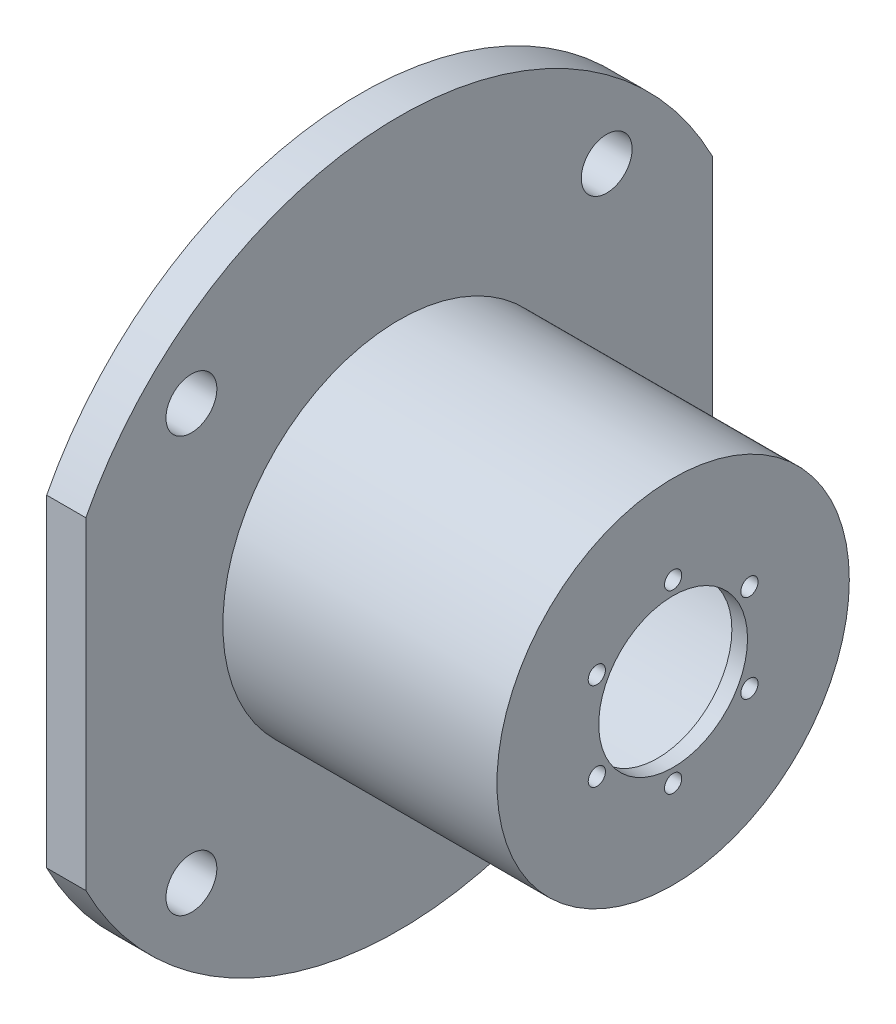
ISO-10303-21;
HEADER;
FILE_DESCRIPTION(('STEP AP214'),'2;1');
FILE_NAME('part.step','',(''),(''),'','','');
FILE_SCHEMA(('AUTOMOTIVE_DESIGN { 1 0 10303 214 1 1 1 1 }'));
ENDSEC;
DATA;
#1=APPLICATION_CONTEXT('core data for automotive mechanical design processes');
#2=APPLICATION_PROTOCOL_DEFINITION('international standard','automotive_design',2000,#1);
#3=PRODUCT_CONTEXT('',#1,'mechanical');
#4=PRODUCT('Part','Part','',(#3));
#5=PRODUCT_RELATED_PRODUCT_CATEGORY('part','',(#4));
#6=PRODUCT_DEFINITION_FORMATION('','',#4);
#7=PRODUCT_DEFINITION_CONTEXT('part definition',#1,'design');
#8=PRODUCT_DEFINITION('design','',#6,#7);
#9=PRODUCT_DEFINITION_SHAPE('','',#8);
#10=(LENGTH_UNIT() NAMED_UNIT(*) SI_UNIT(.MILLI.,.METRE.));
#11=(NAMED_UNIT(*) PLANE_ANGLE_UNIT() SI_UNIT($,.RADIAN.));
#12=(NAMED_UNIT(*) SI_UNIT($,.STERADIAN.) SOLID_ANGLE_UNIT());
#13=UNCERTAINTY_MEASURE_WITH_UNIT(LENGTH_MEASURE(1.E-05),#10,'distance_accuracy_value','');
#14=(GEOMETRIC_REPRESENTATION_CONTEXT(3) GLOBAL_UNCERTAINTY_ASSIGNED_CONTEXT((#13)) GLOBAL_UNIT_ASSIGNED_CONTEXT((#10,
#11,#12)) REPRESENTATION_CONTEXT('',''));
#15=CARTESIAN_POINT('',(0.,0.,0.));
#16=DIRECTION('',(0.,0.,1.));
#17=DIRECTION('',(1.,0.,0.));
#18=AXIS2_PLACEMENT_3D('',#15,#16,#17);
#19=CARTESIAN_POINT('',(0.,0.,0.));
#20=DIRECTION('',(1.,0.,0.));
#21=DIRECTION('',(0.,0.,-1.));
#22=AXIS2_PLACEMENT_3D('',#19,#20,#21);
#23=CYLINDRICAL_SURFACE('',#22,45.);
#24=DIRECTION('',(1.,0.,0.));
#25=VECTOR('',#24,1.);
#26=CARTESIAN_POINT('',(-40.,20.6155281280883,40.));
#27=LINE('',#26,#25);
#28=CARTESIAN_POINT('',(-40.,20.6155281280883,40.));
#29=VERTEX_POINT('',#28);
#30=CARTESIAN_POINT('',(-35.,20.6155281280883,40.));
#31=VERTEX_POINT('',#30);
#32=EDGE_CURVE('E81',#29,#31,#27,.T.);
#33=ORIENTED_EDGE('',*,*,#32,.T.);
#34=CARTESIAN_POINT('',(-35.,0.,0.));
#35=DIRECTION('',(1.,0.,0.));
#36=DIRECTION('',(0.,0.,-1.));
#37=AXIS2_PLACEMENT_3D('',#34,#35,#36);
#38=CIRCLE('',#37,45.);
#39=CARTESIAN_POINT('',(-35.,20.6155281280883,-40.));
#40=VERTEX_POINT('',#39);
#41=EDGE_CURVE('E102',#40,#31,#38,.T.);
#42=ORIENTED_EDGE('',*,*,#41,.F.);
#43=DIRECTION('',(1.,0.,0.));
#44=VECTOR('',#43,1.);
#45=CARTESIAN_POINT('',(-40.,20.6155281280883,-40.));
#46=LINE('',#45,#44);
#47=CARTESIAN_POINT('',(-40.,20.6155281280883,-40.));
#48=VERTEX_POINT('',#47);
#49=EDGE_CURVE('E62',#48,#40,#46,.T.);
#50=ORIENTED_EDGE('',*,*,#49,.F.);
#51=CARTESIAN_POINT('',(-40.,0.,0.));
#52=DIRECTION('',(1.,0.,0.));
#53=DIRECTION('',(0.,0.,-1.));
#54=AXIS2_PLACEMENT_3D('',#51,#52,#53);
#55=CIRCLE('',#54,45.);
#56=EDGE_CURVE('E101',#48,#29,#55,.T.);
#57=ORIENTED_EDGE('',*,*,#56,.T.);
#58=EDGE_LOOP('',(#33,#42,#50,#57));
#59=FACE_BOUND('',#58,.T.);
#60=ADVANCED_FACE('F39',(#59),#23,.T.);
#61=CARTESIAN_POINT('',(0.,0.,0.));
#62=DIRECTION('',(1.,0.,0.));
#63=DIRECTION('',(0.,0.,-1.));
#64=AXIS2_PLACEMENT_3D('',#61,#62,#63);
#65=CYLINDRICAL_SURFACE('',#64,9.5);
#66=CARTESIAN_POINT('',(0.,0.,0.));
#67=DIRECTION('',(1.,0.,0.));
#68=DIRECTION('',(0.,0.,-1.));
#69=AXIS2_PLACEMENT_3D('',#66,#67,#68);
#70=CIRCLE('',#69,9.5);
#71=CARTESIAN_POINT('',(0.,0.,-9.5));
#72=VERTEX_POINT('',#71);
#73=EDGE_CURVE('E130',#72,#72,#70,.T.);
#74=ORIENTED_EDGE('',*,*,#73,.T.);
#75=EDGE_LOOP('',(#74));
#76=FACE_BOUND('',#75,.T.);
#77=CARTESIAN_POINT('',(-2.,0.,0.));
#78=DIRECTION('',(1.,0.,0.));
#79=DIRECTION('',(0.,0.,-1.));
#80=AXIS2_PLACEMENT_3D('',#77,#78,#79);
#81=CIRCLE('',#80,9.5);
#82=CARTESIAN_POINT('',(-2.,0.,-9.5));
#83=VERTEX_POINT('',#82);
#84=EDGE_CURVE('E114',#83,#83,#81,.T.);
#85=ORIENTED_EDGE('',*,*,#84,.F.);
#86=EDGE_LOOP('',(#85));
#87=FACE_BOUND('',#86,.T.);
#88=ADVANCED_FACE('F41',(#76,#87),#65,.F.);
#89=CARTESIAN_POINT('',(-2.,9.5,0.));
#90=DIRECTION('',(-1.,0.,0.));
#91=DIRECTION('',(0.,0.,1.));
#92=AXIS2_PLACEMENT_3D('',#89,#90,#91);
#93=PLANE('',#92);
#94=CARTESIAN_POINT('',(-1.99999999999999,5.62500000000076,-9.74278579257537));
#95=DIRECTION('',(-1.,0.,0.));
#96=DIRECTION('',(0.,0.,1.));
#97=AXIS2_PLACEMENT_3D('',#94,#95,#96);
#98=CIRCLE('',#97,1.1);
#99=CARTESIAN_POINT('',(-1.99999999999999,5.62500000000076,-8.64278579257537));
#100=VERTEX_POINT('',#99);
#101=EDGE_CURVE('E121',#100,#100,#98,.T.);
#102=ORIENTED_EDGE('',*,*,#101,.F.);
#103=EDGE_LOOP('',(#102));
#104=FACE_BOUND('',#103,.T.);
#105=CARTESIAN_POINT('',(-1.99999999999999,-5.62499999999924,-9.74278579257625));
#106=DIRECTION('',(-1.,0.,0.));
#107=DIRECTION('',(0.,0.,1.));
#108=AXIS2_PLACEMENT_3D('',#105,#106,#107);
#109=CIRCLE('',#108,1.1);
#110=CARTESIAN_POINT('',(-1.99999999999999,-5.62499999999924,-8.64278579257626));
#111=VERTEX_POINT('',#110);
#112=EDGE_CURVE('E189',#111,#111,#109,.T.);
#113=ORIENTED_EDGE('',*,*,#112,.F.);
#114=EDGE_LOOP('',(#113));
#115=FACE_BOUND('',#114,.T.);
#116=CARTESIAN_POINT('',(-1.99999999999999,11.25,0.));
#117=DIRECTION('',(-1.,0.,0.));
#118=DIRECTION('',(0.,0.,1.));
#119=AXIS2_PLACEMENT_3D('',#116,#117,#118);
#120=CIRCLE('',#119,1.1);
#121=CARTESIAN_POINT('',(-1.99999999999999,11.25,1.1));
#122=VERTEX_POINT('',#121);
#123=EDGE_CURVE('E187',#122,#122,#120,.T.);
#124=ORIENTED_EDGE('',*,*,#123,.F.);
#125=EDGE_LOOP('',(#124));
#126=FACE_BOUND('',#125,.T.);
#127=CARTESIAN_POINT('',(-1.99999999999999,-11.25,-1.75782910471805E-12));
#128=DIRECTION('',(-1.,0.,0.));
#129=DIRECTION('',(0.,0.,1.));
#130=AXIS2_PLACEMENT_3D('',#127,#128,#129);
#131=CIRCLE('',#130,1.1);
#132=CARTESIAN_POINT('',(-1.99999999999999,-11.25,1.09999999999824));
#133=VERTEX_POINT('',#132);
#134=EDGE_CURVE('E184',#133,#133,#131,.T.);
#135=ORIENTED_EDGE('',*,*,#134,.F.);
#136=EDGE_LOOP('',(#135));
#137=FACE_BOUND('',#136,.T.);
#138=CARTESIAN_POINT('',(-1.99999999999999,-5.62500000000076,9.74278579257362));
#139=DIRECTION('',(-1.,0.,0.));
#140=DIRECTION('',(0.,0.,1.));
#141=AXIS2_PLACEMENT_3D('',#138,#139,#140);
#142=CIRCLE('',#141,1.1);
#143=CARTESIAN_POINT('',(-1.99999999999999,-5.62500000000076,10.8427857925736));
#144=VERTEX_POINT('',#143);
#145=EDGE_CURVE('E181',#144,#144,#142,.T.);
#146=ORIENTED_EDGE('',*,*,#145,.F.);
#147=EDGE_LOOP('',(#146));
#148=FACE_BOUND('',#147,.T.);
#149=CARTESIAN_POINT('',(-1.99999999999999,5.62499999999923,9.7427857925745));
#150=DIRECTION('',(-1.,0.,0.));
#151=DIRECTION('',(0.,0.,1.));
#152=AXIS2_PLACEMENT_3D('',#149,#150,#151);
#153=CIRCLE('',#152,1.1);
#154=CARTESIAN_POINT('',(-1.99999999999999,5.62499999999923,10.8427857925745));
#155=VERTEX_POINT('',#154);
#156=EDGE_CURVE('E178',#155,#155,#153,.T.);
#157=ORIENTED_EDGE('',*,*,#156,.F.);
#158=EDGE_LOOP('',(#157));
#159=FACE_BOUND('',#158,.T.);
#160=ORIENTED_EDGE('',*,*,#84,.T.);
#161=EDGE_LOOP('',(#160));
#162=FACE_BOUND('',#161,.T.);
#163=CARTESIAN_POINT('',(-2.,0.,0.));
#164=DIRECTION('',(1.,0.,0.));
#165=DIRECTION('',(0.,0.,-1.));
#166=AXIS2_PLACEMENT_3D('',#163,#164,#165);
#167=CIRCLE('',#166,20.);
#168=CARTESIAN_POINT('',(-2.,0.,-20.));
#169=VERTEX_POINT('',#168);
#170=EDGE_CURVE('E111',#169,#169,#167,.T.);
#171=ORIENTED_EDGE('',*,*,#170,.F.);
#172=EDGE_LOOP('',(#171));
#173=FACE_BOUND('',#172,.T.);
#174=ADVANCED_FACE('F199',(#104,#115,#126,#137,#148,#159,#162,#173),#93,.T.);
#175=CARTESIAN_POINT('',(0.,0.,0.));
#176=DIRECTION('',(1.,0.,0.));
#177=DIRECTION('',(0.,0.,-1.));
#178=AXIS2_PLACEMENT_3D('',#175,#176,#177);
#179=CYLINDRICAL_SURFACE('',#178,20.);
#180=ORIENTED_EDGE('',*,*,#170,.T.);
#181=EDGE_LOOP('',(#180));
#182=FACE_BOUND('',#181,.T.);
#183=CARTESIAN_POINT('',(-40.,0.,0.));
#184=DIRECTION('',(1.,0.,0.));
#185=DIRECTION('',(0.,0.,-1.));
#186=AXIS2_PLACEMENT_3D('',#183,#184,#185);
#187=CIRCLE('',#186,20.);
#188=CARTESIAN_POINT('',(-40.,0.,-20.));
#189=VERTEX_POINT('',#188);
#190=EDGE_CURVE('E104',#189,#189,#187,.T.);
#191=ORIENTED_EDGE('',*,*,#190,.F.);
#192=EDGE_LOOP('',(#191));
#193=FACE_BOUND('',#192,.T.);
#194=ADVANCED_FACE('F202',(#182,#193),#179,.F.);
#195=CARTESIAN_POINT('',(-40.,20.,0.));
#196=DIRECTION('',(-1.,0.,0.));
#197=DIRECTION('',(0.,0.,1.));
#198=AXIS2_PLACEMENT_3D('',#195,#196,#197);
#199=PLANE('',#198);
#200=CARTESIAN_POINT('',(-40.,26.5165042944956,26.5165042944955));
#201=DIRECTION('',(1.,0.,0.));
#202=DIRECTION('',(0.,0.,-1.));
#203=AXIS2_PLACEMENT_3D('',#200,#201,#202);
#204=CIRCLE('',#203,3.25);
#205=CARTESIAN_POINT('',(-40.,26.5165042944956,23.2665042944955));
#206=VERTEX_POINT('',#205);
#207=EDGE_CURVE('E157',#206,#206,#204,.T.);
#208=ORIENTED_EDGE('',*,*,#207,.T.);
#209=EDGE_LOOP('',(#208));
#210=FACE_BOUND('',#209,.T.);
#211=DIRECTION('',(0.,1.,0.));
#212=VECTOR('',#211,1.);
#213=CARTESIAN_POINT('',(-40.,20.6155281280883,40.));
#214=LINE('',#213,#212);
#215=CARTESIAN_POINT('',(-40.,-20.6155281280883,40.));
#216=VERTEX_POINT('',#215);
#217=EDGE_CURVE('E78',#216,#29,#214,.T.);
#218=ORIENTED_EDGE('',*,*,#217,.T.);
#219=ORIENTED_EDGE('',*,*,#56,.F.);
#220=DIRECTION('',(0.,-1.,0.));
#221=VECTOR('',#220,1.);
#222=CARTESIAN_POINT('',(-40.,20.6155281280883,-40.));
#223=LINE('',#222,#221);
#224=CARTESIAN_POINT('',(-40.,-20.6155281280883,-40.));
#225=VERTEX_POINT('',#224);
#226=EDGE_CURVE('E100',#48,#225,#223,.T.);
#227=ORIENTED_EDGE('',*,*,#226,.T.);
#228=EDGE_CURVE('E93',#216,#225,#55,.T.);
#229=ORIENTED_EDGE('',*,*,#228,.F.);
#230=EDGE_LOOP('',(#218,#219,#227,#229));
#231=FACE_BOUND('',#230,.T.);
#232=CARTESIAN_POINT('',(-40.,-26.5165042944955,26.5165042944956));
#233=DIRECTION('',(1.,0.,0.));
#234=DIRECTION('',(0.,0.,-1.));
#235=AXIS2_PLACEMENT_3D('',#232,#233,#234);
#236=CIRCLE('',#235,3.25);
#237=CARTESIAN_POINT('',(-40.,-26.5165042944955,23.2665042944956));
#238=VERTEX_POINT('',#237);
#239=EDGE_CURVE('E160',#238,#238,#236,.T.);
#240=ORIENTED_EDGE('',*,*,#239,.T.);
#241=EDGE_LOOP('',(#240));
#242=FACE_BOUND('',#241,.T.);
#243=CARTESIAN_POINT('',(-40.,-26.5165042944956,-26.5165042944955));
#244=DIRECTION('',(1.,0.,0.));
#245=DIRECTION('',(0.,0.,-1.));
#246=AXIS2_PLACEMENT_3D('',#243,#244,#245);
#247=CIRCLE('',#246,3.25);
#248=CARTESIAN_POINT('',(-40.,-26.5165042944956,-29.7665042944955));
#249=VERTEX_POINT('',#248);
#250=EDGE_CURVE('E169',#249,#249,#247,.T.);
#251=ORIENTED_EDGE('',*,*,#250,.T.);
#252=EDGE_LOOP('',(#251));
#253=FACE_BOUND('',#252,.T.);
#254=CARTESIAN_POINT('',(-40.,26.5165042944955,-26.5165042944956));
#255=DIRECTION('',(1.,0.,0.));
#256=DIRECTION('',(0.,0.,-1.));
#257=AXIS2_PLACEMENT_3D('',#254,#255,#256);
#258=CIRCLE('',#257,3.25);
#259=CARTESIAN_POINT('',(-40.,26.5165042944955,-29.7665042944956));
#260=VERTEX_POINT('',#259);
#261=EDGE_CURVE('E166',#260,#260,#258,.T.);
#262=ORIENTED_EDGE('',*,*,#261,.T.);
#263=EDGE_LOOP('',(#262));
#264=FACE_BOUND('',#263,.T.);
#265=ORIENTED_EDGE('',*,*,#190,.T.);
#266=EDGE_LOOP('',(#265));
#267=FACE_BOUND('',#266,.T.);
#268=ADVANCED_FACE('F98',(#210,#231,#242,#253,#264,#267),#199,.T.);
#269=DIRECTION('',(1.,0.,0.));
#270=VECTOR('',#269,1.);
#271=CARTESIAN_POINT('',(-40.,-20.6155281280883,40.));
#272=LINE('',#271,#270);
#273=CARTESIAN_POINT('',(-35.,-20.6155281280883,40.));
#274=VERTEX_POINT('',#273);
#275=EDGE_CURVE('E54',#216,#274,#272,.T.);
#276=ORIENTED_EDGE('',*,*,#275,.F.);
#277=ORIENTED_EDGE('',*,*,#228,.T.);
#278=DIRECTION('',(1.,0.,0.));
#279=VECTOR('',#278,1.);
#280=CARTESIAN_POINT('',(-40.,-20.6155281280883,-40.));
#281=LINE('',#280,#279);
#282=CARTESIAN_POINT('',(-35.,-20.6155281280883,-40.));
#283=VERTEX_POINT('',#282);
#284=EDGE_CURVE('E167',#225,#283,#281,.T.);
#285=ORIENTED_EDGE('',*,*,#284,.T.);
#286=EDGE_CURVE('E95',#274,#283,#38,.T.);
#287=ORIENTED_EDGE('',*,*,#286,.F.);
#288=EDGE_LOOP('',(#276,#277,#285,#287));
#289=FACE_BOUND('',#288,.T.);
#290=ADVANCED_FACE('F91',(#289),#23,.T.);
#291=CARTESIAN_POINT('',(-35.,45.,0.));
#292=DIRECTION('',(1.,0.,0.));
#293=DIRECTION('',(0.,0.,-1.));
#294=AXIS2_PLACEMENT_3D('',#291,#292,#293);
#295=PLANE('',#294);
#296=CARTESIAN_POINT('',(-35.,26.5165042944956,26.5165042944955));
#297=DIRECTION('',(1.,0.,0.));
#298=DIRECTION('',(0.,0.,-1.));
#299=AXIS2_PLACEMENT_3D('',#296,#297,#298);
#300=CIRCLE('',#299,3.25);
#301=CARTESIAN_POINT('',(-35.,26.5165042944956,23.2665042944955));
#302=VERTEX_POINT('',#301);
#303=EDGE_CURVE('E43',#302,#302,#300,.T.);
#304=ORIENTED_EDGE('',*,*,#303,.F.);
#305=EDGE_LOOP('',(#304));
#306=FACE_BOUND('',#305,.T.);
#307=DIRECTION('',(0.,1.,0.));
#308=VECTOR('',#307,1.);
#309=CARTESIAN_POINT('',(-35.,45.,40.));
#310=LINE('',#309,#308);
#311=EDGE_CURVE('E11',#274,#31,#310,.T.);
#312=ORIENTED_EDGE('',*,*,#311,.F.);
#313=ORIENTED_EDGE('',*,*,#286,.T.);
#314=DIRECTION('',(0.,-1.,0.));
#315=VECTOR('',#314,1.);
#316=CARTESIAN_POINT('',(-35.,45.,-40.));
#317=LINE('',#316,#315);
#318=EDGE_CURVE('E48',#40,#283,#317,.T.);
#319=ORIENTED_EDGE('',*,*,#318,.F.);
#320=ORIENTED_EDGE('',*,*,#41,.T.);
#321=EDGE_LOOP('',(#312,#313,#319,#320));
#322=FACE_BOUND('',#321,.T.);
#323=CARTESIAN_POINT('',(-35.,-26.5165042944955,26.5165042944956));
#324=DIRECTION('',(1.,0.,0.));
#325=DIRECTION('',(0.,0.,-1.));
#326=AXIS2_PLACEMENT_3D('',#323,#324,#325);
#327=CIRCLE('',#326,3.25);
#328=CARTESIAN_POINT('',(-35.,-26.5165042944955,23.2665042944956));
#329=VERTEX_POINT('',#328);
#330=EDGE_CURVE('E125',#329,#329,#327,.T.);
#331=ORIENTED_EDGE('',*,*,#330,.F.);
#332=EDGE_LOOP('',(#331));
#333=FACE_BOUND('',#332,.T.);
#334=CARTESIAN_POINT('',(-35.,-26.5165042944956,-26.5165042944955));
#335=DIRECTION('',(1.,0.,0.));
#336=DIRECTION('',(0.,0.,-1.));
#337=AXIS2_PLACEMENT_3D('',#334,#335,#336);
#338=CIRCLE('',#337,3.25);
#339=CARTESIAN_POINT('',(-35.,-26.5165042944956,-29.7665042944955));
#340=VERTEX_POINT('',#339);
#341=EDGE_CURVE('E120',#340,#340,#338,.T.);
#342=ORIENTED_EDGE('',*,*,#341,.F.);
#343=EDGE_LOOP('',(#342));
#344=FACE_BOUND('',#343,.T.);
#345=CARTESIAN_POINT('',(-35.,26.5165042944955,-26.5165042944956));
#346=DIRECTION('',(1.,0.,0.));
#347=DIRECTION('',(0.,0.,-1.));
#348=AXIS2_PLACEMENT_3D('',#345,#346,#347);
#349=CIRCLE('',#348,3.25);
#350=CARTESIAN_POINT('',(-35.,26.5165042944955,-29.7665042944956));
#351=VERTEX_POINT('',#350);
#352=EDGE_CURVE('E117',#351,#351,#349,.T.);
#353=ORIENTED_EDGE('',*,*,#352,.F.);
#354=EDGE_LOOP('',(#353));
#355=FACE_BOUND('',#354,.T.);
#356=CARTESIAN_POINT('',(-35.,0.,0.));
#357=DIRECTION('',(1.,0.,0.));
#358=DIRECTION('',(0.,0.,-1.));
#359=AXIS2_PLACEMENT_3D('',#356,#357,#358);
#360=CIRCLE('',#359,22.5);
#361=CARTESIAN_POINT('',(-35.,0.,-22.5));
#362=VERTEX_POINT('',#361);
#363=EDGE_CURVE('E139',#362,#362,#360,.T.);
#364=ORIENTED_EDGE('',*,*,#363,.F.);
#365=EDGE_LOOP('',(#364));
#366=FACE_BOUND('',#365,.T.);
#367=ADVANCED_FACE('F147',(#306,#322,#333,#344,#355,#366),#295,.T.);
#368=CARTESIAN_POINT('',(0.,0.,0.));
#369=DIRECTION('',(1.,0.,0.));
#370=DIRECTION('',(0.,0.,-1.));
#371=AXIS2_PLACEMENT_3D('',#368,#369,#370);
#372=CYLINDRICAL_SURFACE('',#371,22.5);
#373=ORIENTED_EDGE('',*,*,#363,.T.);
#374=EDGE_LOOP('',(#373));
#375=FACE_BOUND('',#374,.T.);
#376=CARTESIAN_POINT('',(0.,0.,0.));
#377=DIRECTION('',(1.,0.,0.));
#378=DIRECTION('',(0.,0.,-1.));
#379=AXIS2_PLACEMENT_3D('',#376,#377,#378);
#380=CIRCLE('',#379,22.5);
#381=CARTESIAN_POINT('',(0.,0.,-22.5));
#382=VERTEX_POINT('',#381);
#383=EDGE_CURVE('E134',#382,#382,#380,.T.);
#384=ORIENTED_EDGE('',*,*,#383,.F.);
#385=EDGE_LOOP('',(#384));
#386=FACE_BOUND('',#385,.T.);
#387=ADVANCED_FACE('F235',(#375,#386),#372,.T.);
#388=CARTESIAN_POINT('',(0.,22.5,0.));
#389=DIRECTION('',(1.,0.,0.));
#390=DIRECTION('',(0.,0.,-1.));
#391=AXIS2_PLACEMENT_3D('',#388,#389,#390);
#392=PLANE('',#391);
#393=CARTESIAN_POINT('',(0.,5.62500000000076,-9.74278579257537));
#394=DIRECTION('',(1.,0.,0.));
#395=DIRECTION('',(0.,0.,-1.));
#396=AXIS2_PLACEMENT_3D('',#393,#394,#395);
#397=CIRCLE('',#396,1.1);
#398=CARTESIAN_POINT('',(0.,5.62500000000076,-10.8427857925754));
#399=VERTEX_POINT('',#398);
#400=EDGE_CURVE('E154',#399,#399,#397,.T.);
#401=ORIENTED_EDGE('',*,*,#400,.F.);
#402=EDGE_LOOP('',(#401));
#403=FACE_BOUND('',#402,.T.);
#404=CARTESIAN_POINT('',(0.,-5.62499999999924,-9.74278579257625));
#405=DIRECTION('',(1.,0.,0.));
#406=DIRECTION('',(0.,0.,-1.));
#407=AXIS2_PLACEMENT_3D('',#404,#405,#406);
#408=CIRCLE('',#407,1.1);
#409=CARTESIAN_POINT('',(0.,-5.62499999999924,-10.8427857925763));
#410=VERTEX_POINT('',#409);
#411=EDGE_CURVE('E151',#410,#410,#408,.T.);
#412=ORIENTED_EDGE('',*,*,#411,.F.);
#413=EDGE_LOOP('',(#412));
#414=FACE_BOUND('',#413,.T.);
#415=CARTESIAN_POINT('',(0.,11.25,0.));
#416=DIRECTION('',(1.,0.,0.));
#417=DIRECTION('',(0.,0.,-1.));
#418=AXIS2_PLACEMENT_3D('',#415,#416,#417);
#419=CIRCLE('',#418,1.1);
#420=CARTESIAN_POINT('',(0.,11.25,-1.1));
#421=VERTEX_POINT('',#420);
#422=EDGE_CURVE('E163',#421,#421,#419,.T.);
#423=ORIENTED_EDGE('',*,*,#422,.F.);
#424=EDGE_LOOP('',(#423));
#425=FACE_BOUND('',#424,.T.);
#426=CARTESIAN_POINT('',(0.,-11.25,-1.75782910471805E-12));
#427=DIRECTION('',(1.,0.,0.));
#428=DIRECTION('',(0.,0.,-1.));
#429=AXIS2_PLACEMENT_3D('',#426,#427,#428);
#430=CIRCLE('',#429,1.1);
#431=CARTESIAN_POINT('',(0.,-11.25,-1.10000000000176));
#432=VERTEX_POINT('',#431);
#433=EDGE_CURVE('E86',#432,#432,#430,.T.);
#434=ORIENTED_EDGE('',*,*,#433,.F.);
#435=EDGE_LOOP('',(#434));
#436=FACE_BOUND('',#435,.T.);
#437=CARTESIAN_POINT('',(0.,-5.62500000000076,9.74278579257362));
#438=DIRECTION('',(1.,0.,0.));
#439=DIRECTION('',(0.,0.,-1.));
#440=AXIS2_PLACEMENT_3D('',#437,#438,#439);
#441=CIRCLE('',#440,1.1);
#442=CARTESIAN_POINT('',(0.,-5.62500000000076,8.64278579257361));
#443=VERTEX_POINT('',#442);
#444=EDGE_CURVE('E288',#443,#443,#441,.T.);
#445=ORIENTED_EDGE('',*,*,#444,.F.);
#446=EDGE_LOOP('',(#445));
#447=FACE_BOUND('',#446,.T.);
#448=CARTESIAN_POINT('',(0.,5.62499999999923,9.7427857925745));
#449=DIRECTION('',(1.,0.,0.));
#450=DIRECTION('',(0.,0.,-1.));
#451=AXIS2_PLACEMENT_3D('',#448,#449,#450);
#452=CIRCLE('',#451,1.1);
#453=CARTESIAN_POINT('',(0.,5.62499999999923,8.6427857925745));
#454=VERTEX_POINT('',#453);
#455=EDGE_CURVE('E291',#454,#454,#452,.T.);
#456=ORIENTED_EDGE('',*,*,#455,.F.);
#457=EDGE_LOOP('',(#456));
#458=FACE_BOUND('',#457,.T.);
#459=ORIENTED_EDGE('',*,*,#383,.T.);
#460=EDGE_LOOP('',(#459));
#461=FACE_BOUND('',#460,.T.);
#462=ORIENTED_EDGE('',*,*,#73,.F.);
#463=EDGE_LOOP('',(#462));
#464=FACE_BOUND('',#463,.T.);
#465=ADVANCED_FACE('F239',(#403,#414,#425,#436,#447,#458,#461,#464),#392,.T.);
#466=CARTESIAN_POINT('',(-40.,5.62499999999923,9.7427857925745));
#467=DIRECTION('',(1.,0.,0.));
#468=DIRECTION('',(0.,0.,-1.));
#469=AXIS2_PLACEMENT_3D('',#466,#467,#468);
#470=CYLINDRICAL_SURFACE('',#469,1.1);
#471=ORIENTED_EDGE('',*,*,#156,.T.);
#472=EDGE_LOOP('',(#471));
#473=FACE_BOUND('',#472,.T.);
#474=ORIENTED_EDGE('',*,*,#455,.T.);
#475=EDGE_LOOP('',(#474));
#476=FACE_BOUND('',#475,.T.);
#477=ADVANCED_FACE('F242',(#473,#476),#470,.F.);
#478=CARTESIAN_POINT('',(-40.,-5.62500000000076,9.74278579257362));
#479=DIRECTION('',(1.,0.,0.));
#480=DIRECTION('',(0.,0.,-1.));
#481=AXIS2_PLACEMENT_3D('',#478,#479,#480);
#482=CYLINDRICAL_SURFACE('',#481,1.1);
#483=ORIENTED_EDGE('',*,*,#145,.T.);
#484=EDGE_LOOP('',(#483));
#485=FACE_BOUND('',#484,.T.);
#486=ORIENTED_EDGE('',*,*,#444,.T.);
#487=EDGE_LOOP('',(#486));
#488=FACE_BOUND('',#487,.T.);
#489=ADVANCED_FACE('F275',(#485,#488),#482,.F.);
#490=CARTESIAN_POINT('',(-40.,-11.25,-1.75782910471805E-12));
#491=DIRECTION('',(1.,0.,0.));
#492=DIRECTION('',(0.,0.,-1.));
#493=AXIS2_PLACEMENT_3D('',#490,#491,#492);
#494=CYLINDRICAL_SURFACE('',#493,1.1);
#495=ORIENTED_EDGE('',*,*,#134,.T.);
#496=EDGE_LOOP('',(#495));
#497=FACE_BOUND('',#496,.T.);
#498=ORIENTED_EDGE('',*,*,#433,.T.);
#499=EDGE_LOOP('',(#498));
#500=FACE_BOUND('',#499,.T.);
#501=ADVANCED_FACE('F262',(#497,#500),#494,.F.);
#502=CARTESIAN_POINT('',(-40.,11.25,0.));
#503=DIRECTION('',(1.,0.,0.));
#504=DIRECTION('',(0.,0.,-1.));
#505=AXIS2_PLACEMENT_3D('',#502,#503,#504);
#506=CYLINDRICAL_SURFACE('',#505,1.1);
#507=ORIENTED_EDGE('',*,*,#123,.T.);
#508=EDGE_LOOP('',(#507));
#509=FACE_BOUND('',#508,.T.);
#510=ORIENTED_EDGE('',*,*,#422,.T.);
#511=EDGE_LOOP('',(#510));
#512=FACE_BOUND('',#511,.T.);
#513=ADVANCED_FACE('F258',(#509,#512),#506,.F.);
#514=CARTESIAN_POINT('',(-40.,-5.62499999999924,-9.74278579257625));
#515=DIRECTION('',(1.,0.,0.));
#516=DIRECTION('',(0.,0.,-1.));
#517=AXIS2_PLACEMENT_3D('',#514,#515,#516);
#518=CYLINDRICAL_SURFACE('',#517,1.1);
#519=ORIENTED_EDGE('',*,*,#112,.T.);
#520=EDGE_LOOP('',(#519));
#521=FACE_BOUND('',#520,.T.);
#522=ORIENTED_EDGE('',*,*,#411,.T.);
#523=EDGE_LOOP('',(#522));
#524=FACE_BOUND('',#523,.T.);
#525=ADVANCED_FACE('F261',(#521,#524),#518,.F.);
#526=CARTESIAN_POINT('',(-40.,5.62500000000076,-9.74278579257537));
#527=DIRECTION('',(1.,0.,0.));
#528=DIRECTION('',(0.,0.,-1.));
#529=AXIS2_PLACEMENT_3D('',#526,#527,#528);
#530=CYLINDRICAL_SURFACE('',#529,1.1);
#531=ORIENTED_EDGE('',*,*,#101,.T.);
#532=EDGE_LOOP('',(#531));
#533=FACE_BOUND('',#532,.T.);
#534=ORIENTED_EDGE('',*,*,#400,.T.);
#535=EDGE_LOOP('',(#534));
#536=FACE_BOUND('',#535,.T.);
#537=ADVANCED_FACE('F196',(#533,#536),#530,.F.);
#538=CARTESIAN_POINT('',(-40.,26.5165042944955,-26.5165042944956));
#539=DIRECTION('',(1.,0.,0.));
#540=DIRECTION('',(0.,0.,-1.));
#541=AXIS2_PLACEMENT_3D('',#538,#539,#540);
#542=CYLINDRICAL_SURFACE('',#541,3.25);
#543=ORIENTED_EDGE('',*,*,#352,.T.);
#544=EDGE_LOOP('',(#543));
#545=FACE_BOUND('',#544,.T.);
#546=ORIENTED_EDGE('',*,*,#261,.F.);
#547=EDGE_LOOP('',(#546));
#548=FACE_BOUND('',#547,.T.);
#549=ADVANCED_FACE('F244',(#545,#548),#542,.F.);
#550=CARTESIAN_POINT('',(-40.,20.6155281280883,-40.));
#551=DIRECTION('',(0.,0.,1.));
#552=DIRECTION('',(1.,0.,0.));
#553=AXIS2_PLACEMENT_3D('',#550,#551,#552);
#554=PLANE('',#553);
#555=ORIENTED_EDGE('',*,*,#318,.T.);
#556=ORIENTED_EDGE('',*,*,#284,.F.);
#557=ORIENTED_EDGE('',*,*,#226,.F.);
#558=ORIENTED_EDGE('',*,*,#49,.T.);
#559=EDGE_LOOP('',(#555,#556,#557,#558));
#560=FACE_BOUND('',#559,.T.);
#561=ADVANCED_FACE('F247',(#560),#554,.F.);
#562=CARTESIAN_POINT('',(-40.,-26.5165042944956,-26.5165042944955));
#563=DIRECTION('',(1.,0.,0.));
#564=DIRECTION('',(0.,0.,-1.));
#565=AXIS2_PLACEMENT_3D('',#562,#563,#564);
#566=CYLINDRICAL_SURFACE('',#565,3.25);
#567=ORIENTED_EDGE('',*,*,#341,.T.);
#568=EDGE_LOOP('',(#567));
#569=FACE_BOUND('',#568,.T.);
#570=ORIENTED_EDGE('',*,*,#250,.F.);
#571=EDGE_LOOP('',(#570));
#572=FACE_BOUND('',#571,.T.);
#573=ADVANCED_FACE('F252',(#569,#572),#566,.F.);
#574=CARTESIAN_POINT('',(-40.,-26.5165042944955,26.5165042944956));
#575=DIRECTION('',(1.,0.,0.));
#576=DIRECTION('',(0.,0.,-1.));
#577=AXIS2_PLACEMENT_3D('',#574,#575,#576);
#578=CYLINDRICAL_SURFACE('',#577,3.25);
#579=ORIENTED_EDGE('',*,*,#330,.T.);
#580=EDGE_LOOP('',(#579));
#581=FACE_BOUND('',#580,.T.);
#582=ORIENTED_EDGE('',*,*,#239,.F.);
#583=EDGE_LOOP('',(#582));
#584=FACE_BOUND('',#583,.T.);
#585=ADVANCED_FACE('F249',(#581,#584),#578,.F.);
#586=CARTESIAN_POINT('',(-40.,20.6155281280883,40.));
#587=DIRECTION('',(0.,0.,-1.));
#588=DIRECTION('',(-1.,0.,0.));
#589=AXIS2_PLACEMENT_3D('',#586,#587,#588);
#590=PLANE('',#589);
#591=ORIENTED_EDGE('',*,*,#311,.T.);
#592=ORIENTED_EDGE('',*,*,#32,.F.);
#593=ORIENTED_EDGE('',*,*,#217,.F.);
#594=ORIENTED_EDGE('',*,*,#275,.T.);
#595=EDGE_LOOP('',(#591,#592,#593,#594));
#596=FACE_BOUND('',#595,.T.);
#597=ADVANCED_FACE('F79',(#596),#590,.F.);
#598=CARTESIAN_POINT('',(-40.,26.5165042944956,26.5165042944955));
#599=DIRECTION('',(1.,0.,0.));
#600=DIRECTION('',(0.,0.,-1.));
#601=AXIS2_PLACEMENT_3D('',#598,#599,#600);
#602=CYLINDRICAL_SURFACE('',#601,3.25);
#603=ORIENTED_EDGE('',*,*,#303,.T.);
#604=EDGE_LOOP('',(#603));
#605=FACE_BOUND('',#604,.T.);
#606=ORIENTED_EDGE('',*,*,#207,.F.);
#607=EDGE_LOOP('',(#606));
#608=FACE_BOUND('',#607,.T.);
#609=ADVANCED_FACE('F266',(#605,#608),#602,.F.);
#610=CLOSED_SHELL('',(#60,#88,#174,#194,#268,#290,#367,#387,#465,#477,#489,#501,#513,#525,#537,
#549,#561,#573,#585,#597,#609));
#611=MANIFOLD_SOLID_BREP('B2',#610);
#612=ADVANCED_BREP_SHAPE_REPRESENTATION('',(#18,#611),#14);
#613=SHAPE_DEFINITION_REPRESENTATION(#9,#612);
ENDSEC;
END-ISO-10303-21;
